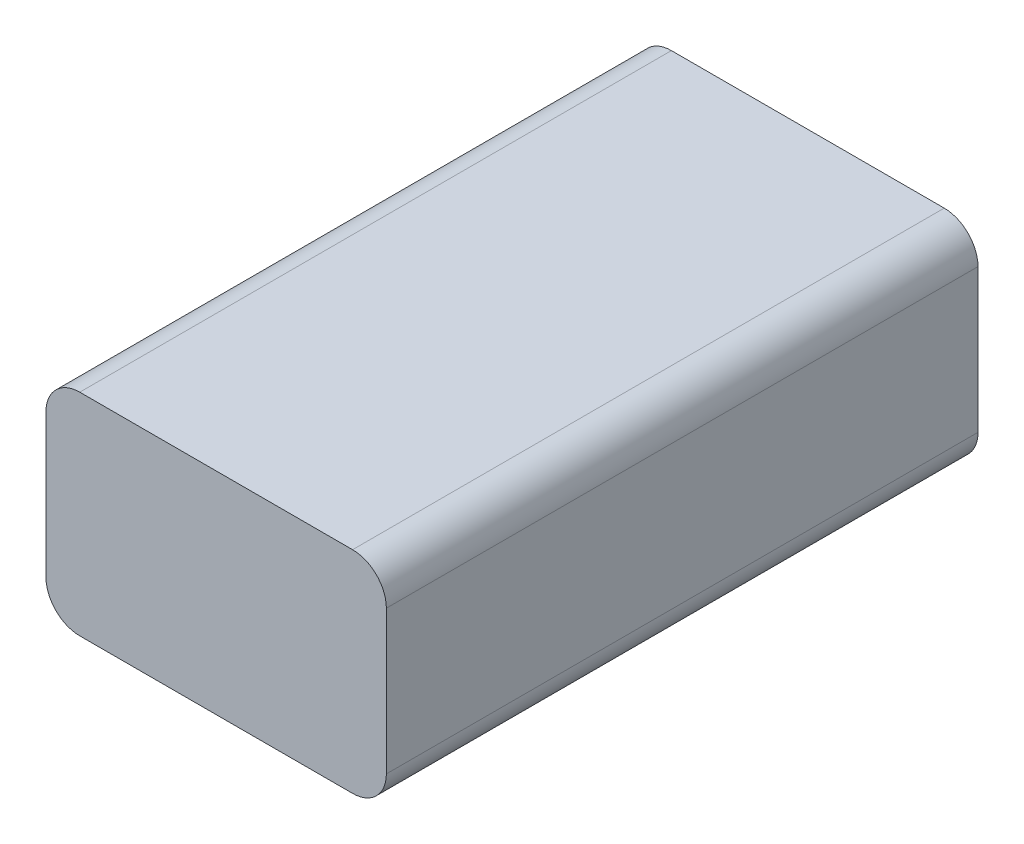
ISO-10303-21;
HEADER;
FILE_DESCRIPTION(('STEP AP214'),'2;1');
FILE_NAME('part.step','',(''),(''),'','','');
FILE_SCHEMA(('AUTOMOTIVE_DESIGN { 1 0 10303 214 1 1 1 1 }'));
ENDSEC;
DATA;
#1=APPLICATION_CONTEXT('core data for automotive mechanical design processes');
#2=APPLICATION_PROTOCOL_DEFINITION('international standard','automotive_design',2000,#1);
#3=PRODUCT_CONTEXT('',#1,'mechanical');
#4=PRODUCT('Part','Part','',(#3));
#5=PRODUCT_RELATED_PRODUCT_CATEGORY('part','',(#4));
#6=PRODUCT_DEFINITION_FORMATION('','',#4);
#7=PRODUCT_DEFINITION_CONTEXT('part definition',#1,'design');
#8=PRODUCT_DEFINITION('design','',#6,#7);
#9=PRODUCT_DEFINITION_SHAPE('','',#8);
#10=(LENGTH_UNIT() NAMED_UNIT(*) SI_UNIT(.MILLI.,.METRE.));
#11=(NAMED_UNIT(*) PLANE_ANGLE_UNIT() SI_UNIT($,.RADIAN.));
#12=(NAMED_UNIT(*) SI_UNIT($,.STERADIAN.) SOLID_ANGLE_UNIT());
#13=UNCERTAINTY_MEASURE_WITH_UNIT(LENGTH_MEASURE(1.E-05),#10,'distance_accuracy_value','');
#14=(GEOMETRIC_REPRESENTATION_CONTEXT(3) GLOBAL_UNCERTAINTY_ASSIGNED_CONTEXT((#13)) GLOBAL_UNIT_ASSIGNED_CONTEXT((#10,
#11,#12)) REPRESENTATION_CONTEXT('',''));
#15=CARTESIAN_POINT('',(0.,0.,0.));
#16=DIRECTION('',(0.,0.,1.));
#17=DIRECTION('',(1.,0.,0.));
#18=AXIS2_PLACEMENT_3D('',#15,#16,#17);
#19=CARTESIAN_POINT('',(0.,15.875,-44.5));
#20=DIRECTION('',(0.,0.,1.));
#21=DIRECTION('',(1.,0.,0.));
#22=AXIS2_PLACEMENT_3D('',#19,#20,#21);
#23=PLANE('',#22);
#24=CARTESIAN_POINT('',(6.06917609963453,7.9375,-44.5));
#25=DIRECTION('',(0.,0.,1.));
#26=DIRECTION('',(1.,0.,0.));
#27=AXIS2_PLACEMENT_3D('',#24,#25,#26);
#28=CIRCLE('',#27,3.10845397462896);
#29=CARTESIAN_POINT('',(9.17763007426349,7.9375,-44.5));
#30=VERTEX_POINT('',#29);
#31=EDGE_CURVE('E364',#30,#30,#28,.F.);
#32=ORIENTED_EDGE('',*,*,#31,.F.);
#33=EDGE_LOOP('',(#32));
#34=FACE_BOUND('',#33,.T.);
#35=DIRECTION('',(0.,-1.,0.));
#36=VECTOR('',#35,1.);
#37=CARTESIAN_POINT('',(25.6,15.875,-44.5));
#38=LINE('',#37,#36);
#39=CARTESIAN_POINT('',(25.6,13.335,-44.5));
#40=VERTEX_POINT('',#39);
#41=CARTESIAN_POINT('',(25.6,2.54,-44.5));
#42=VERTEX_POINT('',#41);
#43=EDGE_CURVE('E353',#40,#42,#38,.T.);
#44=ORIENTED_EDGE('',*,*,#43,.T.);
#45=CARTESIAN_POINT('',(23.06,2.54,-44.5));
#46=DIRECTION('',(0.,0.,1.));
#47=DIRECTION('',(1.,0.,0.));
#48=AXIS2_PLACEMENT_3D('',#45,#46,#47);
#49=CIRCLE('',#48,2.54);
#50=CARTESIAN_POINT('',(23.06,0.,-44.5));
#51=VERTEX_POINT('',#50);
#52=EDGE_CURVE('E384',#42,#51,#49,.F.);
#53=ORIENTED_EDGE('',*,*,#52,.T.);
#54=DIRECTION('',(-1.,0.,0.));
#55=VECTOR('',#54,1.);
#56=CARTESIAN_POINT('',(0.,0.,-44.5));
#57=LINE('',#56,#55);
#58=CARTESIAN_POINT('',(2.54,0.,-44.5));
#59=VERTEX_POINT('',#58);
#60=EDGE_CURVE('E339',#51,#59,#57,.T.);
#61=ORIENTED_EDGE('',*,*,#60,.T.);
#62=CARTESIAN_POINT('',(2.54,2.54,-44.5));
#63=DIRECTION('',(0.,0.,1.));
#64=DIRECTION('',(1.,0.,0.));
#65=AXIS2_PLACEMENT_3D('',#62,#63,#64);
#66=CIRCLE('',#65,2.54);
#67=CARTESIAN_POINT('',(0.,2.54,-44.5));
#68=VERTEX_POINT('',#67);
#69=EDGE_CURVE('E381',#59,#68,#66,.F.);
#70=ORIENTED_EDGE('',*,*,#69,.T.);
#71=DIRECTION('',(0.,-1.,0.));
#72=VECTOR('',#71,1.);
#73=CARTESIAN_POINT('',(0.,15.875,-44.5));
#74=LINE('',#73,#72);
#75=CARTESIAN_POINT('',(0.,13.335,-44.5));
#76=VERTEX_POINT('',#75);
#77=EDGE_CURVE('E343',#76,#68,#74,.T.);
#78=ORIENTED_EDGE('',*,*,#77,.F.);
#79=CARTESIAN_POINT('',(2.54,13.335,-44.5));
#80=DIRECTION('',(0.,0.,1.));
#81=DIRECTION('',(1.,0.,0.));
#82=AXIS2_PLACEMENT_3D('',#79,#80,#81);
#83=CIRCLE('',#82,2.54);
#84=CARTESIAN_POINT('',(2.54,15.875,-44.5));
#85=VERTEX_POINT('',#84);
#86=EDGE_CURVE('E378',#76,#85,#83,.F.);
#87=ORIENTED_EDGE('',*,*,#86,.T.);
#88=DIRECTION('',(-1.,0.,0.));
#89=VECTOR('',#88,1.);
#90=CARTESIAN_POINT('',(0.,15.875,-44.5));
#91=LINE('',#90,#89);
#92=CARTESIAN_POINT('',(23.06,15.875,-44.5));
#93=VERTEX_POINT('',#92);
#94=EDGE_CURVE('E338',#93,#85,#91,.T.);
#95=ORIENTED_EDGE('',*,*,#94,.F.);
#96=CARTESIAN_POINT('',(23.06,13.335,-44.5));
#97=DIRECTION('',(0.,0.,1.));
#98=DIRECTION('',(1.,0.,0.));
#99=AXIS2_PLACEMENT_3D('',#96,#97,#98);
#100=CIRCLE('',#99,2.54);
#101=EDGE_CURVE('E375',#93,#40,#100,.F.);
#102=ORIENTED_EDGE('',*,*,#101,.T.);
#103=EDGE_LOOP('',(#44,#53,#61,#70,#78,#87,#95,#102));
#104=FACE_BOUND('',#103,.T.);
#105=DIRECTION('',(-0.654278635501523,-0.75625357329818,0.));
#106=VECTOR('',#105,1.);
#107=CARTESIAN_POINT('',(22.8214094188601,6.97780152134244,-44.5));
#108=LINE('',#107,#106);
#109=CARTESIAN_POINT('',(22.8214094188601,6.97780152134244,-44.5));
#110=VERTEX_POINT('',#109);
#111=CARTESIAN_POINT('',(19.4902347533947,3.12743470918518,-44.5));
#112=VERTEX_POINT('',#111);
#113=EDGE_CURVE('E200',#110,#112,#108,.T.);
#114=ORIENTED_EDGE('',*,*,#113,.F.);
#115=DIRECTION('',(0.327795488428218,-0.944748706146828,0.));
#116=VECTOR('',#115,1.);
#117=CARTESIAN_POINT('',(21.1524812783761,11.7878668121573,-44.5));
#118=LINE('',#117,#116);
#119=CARTESIAN_POINT('',(21.1524812783761,11.7878668121573,-44.5));
#120=VERTEX_POINT('',#119);
#121=EDGE_CURVE('E260',#120,#110,#118,.T.);
#122=ORIENTED_EDGE('',*,*,#121,.F.);
#123=DIRECTION('',(0.982074123929742,-0.188495132848649,0.));
#124=VECTOR('',#123,1.);
#125=CARTESIAN_POINT('',(16.1523784724267,12.7475652908148,-44.5));
#126=LINE('',#125,#124);
#127=CARTESIAN_POINT('',(16.1523784724267,12.7475652908148,-44.5));
#128=VERTEX_POINT('',#127);
#129=EDGE_CURVE('E291',#128,#120,#126,.T.);
#130=ORIENTED_EDGE('',*,*,#129,.F.);
#131=DIRECTION('',(0.654278635501523,0.756253573298179,0.));
#132=VECTOR('',#131,1.);
#133=CARTESIAN_POINT('',(12.8212038069613,8.89719847865757,-44.5));
#134=LINE('',#133,#132);
#135=CARTESIAN_POINT('',(12.8212038069613,8.89719847865757,-44.5));
#136=VERTEX_POINT('',#135);
#137=EDGE_CURVE('E287',#136,#128,#134,.T.);
#138=ORIENTED_EDGE('',*,*,#137,.F.);
#139=DIRECTION('',(-0.327795488428219,0.944748706146828,0.));
#140=VECTOR('',#139,1.);
#141=CARTESIAN_POINT('',(14.4901319474453,4.08713318784274,-44.5));
#142=LINE('',#141,#140);
#143=CARTESIAN_POINT('',(14.4901319474453,4.08713318784274,-44.5));
#144=VERTEX_POINT('',#143);
#145=EDGE_CURVE('E283',#144,#136,#142,.T.);
#146=ORIENTED_EDGE('',*,*,#145,.F.);
#147=DIRECTION('',(-0.982074123929742,0.188495132848648,0.));
#148=VECTOR('',#147,1.);
#149=CARTESIAN_POINT('',(19.4902347533947,3.12743470918518,-44.5));
#150=LINE('',#149,#148);
#151=EDGE_CURVE('E279',#112,#144,#150,.T.);
#152=ORIENTED_EDGE('',*,*,#151,.F.);
#153=EDGE_LOOP('',(#114,#122,#130,#138,#146,#152));
#154=FACE_BOUND('',#153,.T.);
#155=ADVANCED_FACE('F39',(#34,#104,#154),#23,.F.);
#156=CARTESIAN_POINT('',(0.,15.875,0.));
#157=DIRECTION('',(1.,0.,0.));
#158=DIRECTION('',(0.,0.,-1.));
#159=AXIS2_PLACEMENT_3D('',#156,#157,#158);
#160=PLANE('',#159);
#161=ORIENTED_EDGE('',*,*,#77,.T.);
#162=DIRECTION('',(0.,0.,1.));
#163=VECTOR('',#162,1.);
#164=CARTESIAN_POINT('',(0.,2.54,0.));
#165=LINE('',#164,#163);
#166=CARTESIAN_POINT('',(0.,2.54,0.));
#167=VERTEX_POINT('',#166);
#168=EDGE_CURVE('E406',#68,#167,#165,.T.);
#169=ORIENTED_EDGE('',*,*,#168,.T.);
#170=DIRECTION('',(0.,-1.,0.));
#171=VECTOR('',#170,1.);
#172=CARTESIAN_POINT('',(0.,15.875,0.));
#173=LINE('',#172,#171);
#174=CARTESIAN_POINT('',(0.,13.335,0.));
#175=VERTEX_POINT('',#174);
#176=EDGE_CURVE('E361',#175,#167,#173,.T.);
#177=ORIENTED_EDGE('',*,*,#176,.F.);
#178=DIRECTION('',(0.,0.,1.));
#179=VECTOR('',#178,1.);
#180=CARTESIAN_POINT('',(0.,13.335,0.));
#181=LINE('',#180,#179);
#182=EDGE_CURVE('E403',#175,#76,#181,.F.);
#183=ORIENTED_EDGE('',*,*,#182,.T.);
#184=EDGE_LOOP('',(#161,#169,#177,#183));
#185=FACE_BOUND('',#184,.T.);
#186=ADVANCED_FACE('F442',(#185),#160,.F.);
#187=CARTESIAN_POINT('',(0.,15.875,0.));
#188=DIRECTION('',(0.,0.,-1.));
#189=DIRECTION('',(-1.,0.,0.));
#190=AXIS2_PLACEMENT_3D('',#187,#188,#189);
#191=PLANE('',#190);
#192=DIRECTION('',(1.,0.,0.));
#193=VECTOR('',#192,1.);
#194=CARTESIAN_POINT('',(0.,0.,0.));
#195=LINE('',#194,#193);
#196=CARTESIAN_POINT('',(2.54,0.,0.));
#197=VERTEX_POINT('',#196);
#198=CARTESIAN_POINT('',(23.06,0.,0.));
#199=VERTEX_POINT('',#198);
#200=EDGE_CURVE('E333',#197,#199,#195,.T.);
#201=ORIENTED_EDGE('',*,*,#200,.T.);
#202=CARTESIAN_POINT('',(23.06,2.54,0.));
#203=DIRECTION('',(0.,0.,-1.));
#204=DIRECTION('',(-1.,0.,0.));
#205=AXIS2_PLACEMENT_3D('',#202,#203,#204);
#206=CIRCLE('',#205,2.54);
#207=CARTESIAN_POINT('',(25.6,2.54,0.));
#208=VERTEX_POINT('',#207);
#209=EDGE_CURVE('E400',#199,#208,#206,.F.);
#210=ORIENTED_EDGE('',*,*,#209,.T.);
#211=DIRECTION('',(0.,-1.,0.));
#212=VECTOR('',#211,1.);
#213=CARTESIAN_POINT('',(25.6,15.875,0.));
#214=LINE('',#213,#212);
#215=CARTESIAN_POINT('',(25.6,13.335,0.));
#216=VERTEX_POINT('',#215);
#217=EDGE_CURVE('E357',#216,#208,#214,.T.);
#218=ORIENTED_EDGE('',*,*,#217,.F.);
#219=CARTESIAN_POINT('',(23.06,13.335,0.));
#220=DIRECTION('',(0.,0.,-1.));
#221=DIRECTION('',(-1.,0.,0.));
#222=AXIS2_PLACEMENT_3D('',#219,#220,#221);
#223=CIRCLE('',#222,2.54);
#224=CARTESIAN_POINT('',(23.06,15.875,0.));
#225=VERTEX_POINT('',#224);
#226=EDGE_CURVE('E393',#216,#225,#223,.F.);
#227=ORIENTED_EDGE('',*,*,#226,.T.);
#228=DIRECTION('',(1.,0.,0.));
#229=VECTOR('',#228,1.);
#230=CARTESIAN_POINT('',(0.,15.875,0.));
#231=LINE('',#230,#229);
#232=CARTESIAN_POINT('',(2.54,15.875,0.));
#233=VERTEX_POINT('',#232);
#234=EDGE_CURVE('E334',#233,#225,#231,.T.);
#235=ORIENTED_EDGE('',*,*,#234,.F.);
#236=CARTESIAN_POINT('',(2.54,13.335,0.));
#237=DIRECTION('',(0.,0.,-1.));
#238=DIRECTION('',(-1.,0.,0.));
#239=AXIS2_PLACEMENT_3D('',#236,#237,#238);
#240=CIRCLE('',#239,2.54);
#241=EDGE_CURVE('E63',#233,#175,#240,.F.);
#242=ORIENTED_EDGE('',*,*,#241,.T.);
#243=ORIENTED_EDGE('',*,*,#176,.T.);
#244=CARTESIAN_POINT('',(2.54,2.54,0.));
#245=DIRECTION('',(0.,0.,-1.));
#246=DIRECTION('',(-1.,0.,0.));
#247=AXIS2_PLACEMENT_3D('',#244,#245,#246);
#248=CIRCLE('',#247,2.54);
#249=EDGE_CURVE('E55',#167,#197,#248,.F.);
#250=ORIENTED_EDGE('',*,*,#249,.T.);
#251=EDGE_LOOP('',(#201,#210,#218,#227,#235,#242,#243,#250));
#252=FACE_BOUND('',#251,.T.);
#253=ADVANCED_FACE('F425',(#252),#191,.F.);
#254=CARTESIAN_POINT('',(25.6,15.875,0.));
#255=DIRECTION('',(-1.,0.,0.));
#256=DIRECTION('',(0.,0.,1.));
#257=AXIS2_PLACEMENT_3D('',#254,#255,#256);
#258=PLANE('',#257);
#259=ORIENTED_EDGE('',*,*,#217,.T.);
#260=DIRECTION('',(0.,0.,-1.));
#261=VECTOR('',#260,1.);
#262=CARTESIAN_POINT('',(25.6,2.54,-44.5));
#263=LINE('',#262,#261);
#264=EDGE_CURVE('E371',#208,#42,#263,.T.);
#265=ORIENTED_EDGE('',*,*,#264,.T.);
#266=ORIENTED_EDGE('',*,*,#43,.F.);
#267=DIRECTION('',(0.,0.,-1.));
#268=VECTOR('',#267,1.);
#269=CARTESIAN_POINT('',(25.6,13.335,0.));
#270=LINE('',#269,#268);
#271=EDGE_CURVE('E368',#40,#216,#270,.F.);
#272=ORIENTED_EDGE('',*,*,#271,.T.);
#273=EDGE_LOOP('',(#259,#265,#266,#272));
#274=FACE_BOUND('',#273,.T.);
#275=ADVANCED_FACE('F429',(#274),#258,.F.);
#276=CARTESIAN_POINT('',(0.,15.875,0.));
#277=DIRECTION('',(0.,-1.,0.));
#278=DIRECTION('',(0.,0.,-1.));
#279=AXIS2_PLACEMENT_3D('',#276,#277,#278);
#280=PLANE('',#279);
#281=ORIENTED_EDGE('',*,*,#94,.T.);
#282=DIRECTION('',(0.,0.,1.));
#283=VECTOR('',#282,1.);
#284=CARTESIAN_POINT('',(2.54,15.875,0.));
#285=LINE('',#284,#283);
#286=EDGE_CURVE('E11',#85,#233,#285,.T.);
#287=ORIENTED_EDGE('',*,*,#286,.T.);
#288=ORIENTED_EDGE('',*,*,#234,.T.);
#289=DIRECTION('',(0.,0.,-1.));
#290=VECTOR('',#289,1.);
#291=CARTESIAN_POINT('',(23.06,15.875,0.));
#292=LINE('',#291,#290);
#293=EDGE_CURVE('E48',#225,#93,#292,.T.);
#294=ORIENTED_EDGE('',*,*,#293,.T.);
#295=EDGE_LOOP('',(#281,#287,#288,#294));
#296=FACE_BOUND('',#295,.T.);
#297=ADVANCED_FACE('F413',(#296),#280,.F.);
#298=CARTESIAN_POINT('',(0.,0.,0.));
#299=DIRECTION('',(0.,-1.,0.));
#300=DIRECTION('',(0.,0.,-1.));
#301=AXIS2_PLACEMENT_3D('',#298,#299,#300);
#302=PLANE('',#301);
#303=ORIENTED_EDGE('',*,*,#60,.F.);
#304=DIRECTION('',(0.,0.,-1.));
#305=VECTOR('',#304,1.);
#306=CARTESIAN_POINT('',(23.06,0.,0.));
#307=LINE('',#306,#305);
#308=EDGE_CURVE('E390',#51,#199,#307,.F.);
#309=ORIENTED_EDGE('',*,*,#308,.T.);
#310=ORIENTED_EDGE('',*,*,#200,.F.);
#311=DIRECTION('',(0.,0.,1.));
#312=VECTOR('',#311,1.);
#313=CARTESIAN_POINT('',(2.54,0.,-44.5));
#314=LINE('',#313,#312);
#315=EDGE_CURVE('E387',#197,#59,#314,.F.);
#316=ORIENTED_EDGE('',*,*,#315,.T.);
#317=EDGE_LOOP('',(#303,#309,#310,#316));
#318=FACE_BOUND('',#317,.T.);
#319=ADVANCED_FACE('F436',(#318),#302,.T.);
#320=CARTESIAN_POINT('',(6.06917609963453,7.9375,-46.5));
#321=DIRECTION('',(0.,0.,-1.));
#322=DIRECTION('',(-1.,0.,0.));
#323=AXIS2_PLACEMENT_3D('',#320,#321,#322);
#324=PLANE('',#323);
#325=CARTESIAN_POINT('',(6.06917609963453,7.9375,-46.5));
#326=DIRECTION('',(0.,0.,-1.));
#327=DIRECTION('',(-1.,0.,0.));
#328=AXIS2_PLACEMENT_3D('',#325,#326,#327);
#329=CIRCLE('',#328,3.10845397462896);
#330=CARTESIAN_POINT('',(2.96072212500557,7.9375,-46.5));
#331=VERTEX_POINT('',#330);
#332=EDGE_CURVE('E326',#331,#331,#329,.T.);
#333=ORIENTED_EDGE('',*,*,#332,.T.);
#334=EDGE_LOOP('',(#333));
#335=FACE_BOUND('',#334,.T.);
#336=CARTESIAN_POINT('',(6.06917609963453,7.9375,-46.5));
#337=DIRECTION('',(0.,0.,-1.));
#338=DIRECTION('',(-1.,0.,0.));
#339=AXIS2_PLACEMENT_3D('',#336,#337,#338);
#340=CIRCLE('',#339,2.61557307411876);
#341=CARTESIAN_POINT('',(3.45360302551578,7.9375,-46.5));
#342=VERTEX_POINT('',#341);
#343=EDGE_CURVE('E322',#342,#342,#340,.T.);
#344=ORIENTED_EDGE('',*,*,#343,.F.);
#345=EDGE_LOOP('',(#344));
#346=FACE_BOUND('',#345,.T.);
#347=ADVANCED_FACE('F492',(#335,#346),#324,.T.);
#348=CARTESIAN_POINT('',(6.06917609963453,7.9375,-46.5));
#349=DIRECTION('',(0.,0.,1.));
#350=DIRECTION('',(1.,0.,0.));
#351=AXIS2_PLACEMENT_3D('',#348,#349,#350);
#352=CYLINDRICAL_SURFACE('',#351,3.10845397462896);
#353=ORIENTED_EDGE('',*,*,#332,.F.);
#354=EDGE_LOOP('',(#353));
#355=FACE_BOUND('',#354,.T.);
#356=ORIENTED_EDGE('',*,*,#31,.T.);
#357=EDGE_LOOP('',(#356));
#358=FACE_BOUND('',#357,.T.);
#359=ADVANCED_FACE('F674',(#355,#358),#352,.T.);
#360=CARTESIAN_POINT('',(6.06917609963453,7.9375,-46.5));
#361=DIRECTION('',(0.,0.,1.));
#362=DIRECTION('',(1.,0.,0.));
#363=AXIS2_PLACEMENT_3D('',#360,#361,#362);
#364=CYLINDRICAL_SURFACE('',#363,2.61557307411876);
#365=ORIENTED_EDGE('',*,*,#343,.T.);
#366=EDGE_LOOP('',(#365));
#367=FACE_BOUND('',#366,.T.);
#368=CARTESIAN_POINT('',(6.06917609963453,7.9375,-44.5));
#369=DIRECTION('',(0.,0.,-1.));
#370=DIRECTION('',(-1.,0.,0.));
#371=AXIS2_PLACEMENT_3D('',#368,#369,#370);
#372=CIRCLE('',#371,2.61557307411876);
#373=CARTESIAN_POINT('',(3.45360302551578,7.9375,-44.5));
#374=VERTEX_POINT('',#373);
#375=EDGE_CURVE('E321',#374,#374,#372,.T.);
#376=ORIENTED_EDGE('',*,*,#375,.F.);
#377=EDGE_LOOP('',(#376));
#378=FACE_BOUND('',#377,.T.);
#379=ADVANCED_FACE('F666',(#367,#378),#364,.F.);
#380=ORIENTED_EDGE('',*,*,#375,.T.);
#381=EDGE_LOOP('',(#380));
#382=FACE_BOUND('',#381,.T.);
#383=ADVANCED_FACE('F452',(#382),#23,.F.);
#384=CARTESIAN_POINT('',(0.,0.,-46.5));
#385=DIRECTION('',(0.,0.,-1.));
#386=DIRECTION('',(-1.,0.,0.));
#387=AXIS2_PLACEMENT_3D('',#384,#385,#386);
#388=PLANE('',#387);
#389=DIRECTION('',(-0.654278635501523,-0.75625357329818,0.));
#390=VECTOR('',#389,1.);
#391=CARTESIAN_POINT('',(22.8214094188601,6.97780152134244,-46.5));
#392=LINE('',#391,#390);
#393=CARTESIAN_POINT('',(22.8214094188601,6.97780152134244,-46.5));
#394=VERTEX_POINT('',#393);
#395=CARTESIAN_POINT('',(19.4902347533947,3.12743470918518,-46.5));
#396=VERTEX_POINT('',#395);
#397=EDGE_CURVE('E255',#394,#396,#392,.T.);
#398=ORIENTED_EDGE('',*,*,#397,.T.);
#399=DIRECTION('',(-0.982074123929742,0.188495132848648,0.));
#400=VECTOR('',#399,1.);
#401=CARTESIAN_POINT('',(19.4902347533947,3.12743470918518,-46.5));
#402=LINE('',#401,#400);
#403=CARTESIAN_POINT('',(14.4901319474453,4.08713318784274,-46.5));
#404=VERTEX_POINT('',#403);
#405=EDGE_CURVE('E259',#396,#404,#402,.T.);
#406=ORIENTED_EDGE('',*,*,#405,.T.);
#407=DIRECTION('',(-0.327795488428219,0.944748706146828,0.));
#408=VECTOR('',#407,1.);
#409=CARTESIAN_POINT('',(14.4901319474453,4.08713318784274,-46.5));
#410=LINE('',#409,#408);
#411=CARTESIAN_POINT('',(12.8212038069613,8.89719847865757,-46.5));
#412=VERTEX_POINT('',#411);
#413=EDGE_CURVE('E263',#404,#412,#410,.T.);
#414=ORIENTED_EDGE('',*,*,#413,.T.);
#415=DIRECTION('',(0.654278635501523,0.756253573298179,0.));
#416=VECTOR('',#415,1.);
#417=CARTESIAN_POINT('',(12.8212038069613,8.89719847865757,-46.5));
#418=LINE('',#417,#416);
#419=CARTESIAN_POINT('',(16.1523784724267,12.7475652908148,-46.5));
#420=VERTEX_POINT('',#419);
#421=EDGE_CURVE('E266',#412,#420,#418,.T.);
#422=ORIENTED_EDGE('',*,*,#421,.T.);
#423=DIRECTION('',(0.982074123929742,-0.188495132848649,0.));
#424=VECTOR('',#423,1.);
#425=CARTESIAN_POINT('',(16.1523784724267,12.7475652908148,-46.5));
#426=LINE('',#425,#424);
#427=CARTESIAN_POINT('',(21.1524812783761,11.7878668121573,-46.5));
#428=VERTEX_POINT('',#427);
#429=EDGE_CURVE('E269',#420,#428,#426,.T.);
#430=ORIENTED_EDGE('',*,*,#429,.T.);
#431=DIRECTION('',(0.327795488428218,-0.944748706146828,0.));
#432=VECTOR('',#431,1.);
#433=CARTESIAN_POINT('',(21.1524812783761,11.7878668121573,-46.5));
#434=LINE('',#433,#432);
#435=EDGE_CURVE('E272',#428,#394,#434,.T.);
#436=ORIENTED_EDGE('',*,*,#435,.T.);
#437=EDGE_LOOP('',(#398,#406,#414,#422,#430,#436));
#438=FACE_BOUND('',#437,.T.);
#439=DIRECTION('',(-0.981436231883187,0.191788745099733,0.));
#440=VECTOR('',#439,1.);
#441=CARTESIAN_POINT('',(19.2526577159093,3.7670358831486,-46.5));
#442=LINE('',#441,#440);
#443=CARTESIAN_POINT('',(19.2526577159093,3.7670358831486,-46.5));
#444=VERTEX_POINT('',#443);
#445=CARTESIAN_POINT('',(14.9252542936453,4.6126815246426,-46.5));
#446=VERTEX_POINT('',#445);
#447=EDGE_CURVE('E191',#444,#446,#442,.T.);
#448=ORIENTED_EDGE('',*,*,#447,.F.);
#449=DIRECTION('',(-0.656812041357901,-0.754054336455449,0.));
#450=VECTOR('',#449,1.);
#451=CARTESIAN_POINT('',(22.1487100351748,7.091854358506,-46.5));
#452=LINE('',#451,#450);
#453=CARTESIAN_POINT('',(22.1487100351748,7.091854358506,-46.5));
#454=VERTEX_POINT('',#453);
#455=EDGE_CURVE('E180',#454,#444,#452,.T.);
#456=ORIENTED_EDGE('',*,*,#455,.F.);
#457=DIRECTION('',(0.324624190525286,-0.945843081555182,0.));
#458=VECTOR('',#457,1.);
#459=CARTESIAN_POINT('',(20.7173589321761,11.2623184753574,-46.5));
#460=LINE('',#459,#458);
#461=CARTESIAN_POINT('',(20.7173589321761,11.2623184753574,-46.5));
#462=VERTEX_POINT('',#461);
#463=EDGE_CURVE('E219',#462,#454,#460,.T.);
#464=ORIENTED_EDGE('',*,*,#463,.F.);
#465=DIRECTION('',(0.981436231883187,-0.191788745099733,0.));
#466=VECTOR('',#465,1.);
#467=CARTESIAN_POINT('',(16.3899555099121,12.1079641168514,-46.5));
#468=LINE('',#467,#466);
#469=CARTESIAN_POINT('',(16.3899555099121,12.1079641168514,-46.5));
#470=VERTEX_POINT('',#469);
#471=EDGE_CURVE('E215',#470,#462,#468,.T.);
#472=ORIENTED_EDGE('',*,*,#471,.F.);
#473=DIRECTION('',(0.656812041357901,0.754054336455449,0.));
#474=VECTOR('',#473,1.);
#475=CARTESIAN_POINT('',(13.4939031906466,8.783145641494,-46.5));
#476=LINE('',#475,#474);
#477=CARTESIAN_POINT('',(13.4939031906466,8.783145641494,-46.5));
#478=VERTEX_POINT('',#477);
#479=EDGE_CURVE('E210',#478,#470,#476,.T.);
#480=ORIENTED_EDGE('',*,*,#479,.F.);
#481=DIRECTION('',(-0.324624190525287,0.945843081555182,0.));
#482=VECTOR('',#481,1.);
#483=CARTESIAN_POINT('',(14.9252542936453,4.6126815246426,-46.5));
#484=LINE('',#483,#482);
#485=EDGE_CURVE('E206',#446,#478,#484,.T.);
#486=ORIENTED_EDGE('',*,*,#485,.F.);
#487=EDGE_LOOP('',(#448,#456,#464,#472,#480,#486));
#488=FACE_BOUND('',#487,.T.);
#489=ADVANCED_FACE('F204',(#438,#488),#388,.T.);
#490=CARTESIAN_POINT('',(22.8214094188601,6.97780152134244,-46.5));
#491=DIRECTION('',(-0.75625357329818,0.654278635501523,0.));
#492=DIRECTION('',(-0.654278635501523,-0.75625357329818,0.));
#493=AXIS2_PLACEMENT_3D('',#490,#491,#492);
#494=PLANE('',#493);
#495=ORIENTED_EDGE('',*,*,#113,.T.);
#496=DIRECTION('',(0.,0.,1.));
#497=VECTOR('',#496,1.);
#498=CARTESIAN_POINT('',(19.4902347533947,3.12743470918518,-46.5));
#499=LINE('',#498,#497);
#500=EDGE_CURVE('E317',#396,#112,#499,.T.);
#501=ORIENTED_EDGE('',*,*,#500,.F.);
#502=ORIENTED_EDGE('',*,*,#397,.F.);
#503=DIRECTION('',(0.,0.,1.));
#504=VECTOR('',#503,1.);
#505=CARTESIAN_POINT('',(22.8214094188601,6.97780152134244,-46.5));
#506=LINE('',#505,#504);
#507=EDGE_CURVE('E275',#394,#110,#506,.T.);
#508=ORIENTED_EDGE('',*,*,#507,.T.);
#509=EDGE_LOOP('',(#495,#501,#502,#508));
#510=FACE_BOUND('',#509,.T.);
#511=ADVANCED_FACE('F638',(#510),#494,.F.);
#512=CARTESIAN_POINT('',(19.4902347533947,3.12743470918518,-46.5));
#513=DIRECTION('',(0.188495132848648,0.982074123929742,0.));
#514=DIRECTION('',(-0.982074123929742,0.188495132848648,0.));
#515=AXIS2_PLACEMENT_3D('',#512,#513,#514);
#516=PLANE('',#515);
#517=ORIENTED_EDGE('',*,*,#151,.T.);
#518=DIRECTION('',(0.,0.,1.));
#519=VECTOR('',#518,1.);
#520=CARTESIAN_POINT('',(14.4901319474453,4.08713318784274,-46.5));
#521=LINE('',#520,#519);
#522=EDGE_CURVE('E313',#404,#144,#521,.T.);
#523=ORIENTED_EDGE('',*,*,#522,.F.);
#524=ORIENTED_EDGE('',*,*,#405,.F.);
#525=ORIENTED_EDGE('',*,*,#500,.T.);
#526=EDGE_LOOP('',(#517,#523,#524,#525));
#527=FACE_BOUND('',#526,.T.);
#528=ADVANCED_FACE('F628',(#527),#516,.F.);
#529=CARTESIAN_POINT('',(14.4901319474453,4.08713318784274,-46.5));
#530=DIRECTION('',(0.944748706146828,0.327795488428219,0.));
#531=DIRECTION('',(-0.327795488428219,0.944748706146828,0.));
#532=AXIS2_PLACEMENT_3D('',#529,#530,#531);
#533=PLANE('',#532);
#534=ORIENTED_EDGE('',*,*,#145,.T.);
#535=DIRECTION('',(0.,0.,1.));
#536=VECTOR('',#535,1.);
#537=CARTESIAN_POINT('',(12.8212038069613,8.89719847865757,-46.5));
#538=LINE('',#537,#536);
#539=EDGE_CURVE('E309',#412,#136,#538,.T.);
#540=ORIENTED_EDGE('',*,*,#539,.F.);
#541=ORIENTED_EDGE('',*,*,#413,.F.);
#542=ORIENTED_EDGE('',*,*,#522,.T.);
#543=EDGE_LOOP('',(#534,#540,#541,#542));
#544=FACE_BOUND('',#543,.T.);
#545=ADVANCED_FACE('F618',(#544),#533,.F.);
#546=CARTESIAN_POINT('',(12.8212038069613,8.89719847865757,-46.5));
#547=DIRECTION('',(0.756253573298179,-0.654278635501523,0.));
#548=DIRECTION('',(0.654278635501523,0.75625357329818,0.));
#549=AXIS2_PLACEMENT_3D('',#546,#547,#548);
#550=PLANE('',#549);
#551=ORIENTED_EDGE('',*,*,#137,.T.);
#552=DIRECTION('',(0.,0.,1.));
#553=VECTOR('',#552,1.);
#554=CARTESIAN_POINT('',(16.1523784724267,12.7475652908148,-46.5));
#555=LINE('',#554,#553);
#556=EDGE_CURVE('E305',#420,#128,#555,.T.);
#557=ORIENTED_EDGE('',*,*,#556,.F.);
#558=ORIENTED_EDGE('',*,*,#421,.F.);
#559=ORIENTED_EDGE('',*,*,#539,.T.);
#560=EDGE_LOOP('',(#551,#557,#558,#559));
#561=FACE_BOUND('',#560,.T.);
#562=ADVANCED_FACE('F608',(#561),#550,.F.);
#563=CARTESIAN_POINT('',(16.1523784724267,12.7475652908148,-46.5));
#564=DIRECTION('',(-0.188495132848649,-0.982074123929742,0.));
#565=DIRECTION('',(0.982074123929742,-0.188495132848649,0.));
#566=AXIS2_PLACEMENT_3D('',#563,#564,#565);
#567=PLANE('',#566);
#568=ORIENTED_EDGE('',*,*,#129,.T.);
#569=DIRECTION('',(0.,0.,1.));
#570=VECTOR('',#569,1.);
#571=CARTESIAN_POINT('',(21.1524812783761,11.7878668121573,-46.5));
#572=LINE('',#571,#570);
#573=EDGE_CURVE('E301',#428,#120,#572,.T.);
#574=ORIENTED_EDGE('',*,*,#573,.F.);
#575=ORIENTED_EDGE('',*,*,#429,.F.);
#576=ORIENTED_EDGE('',*,*,#556,.T.);
#577=EDGE_LOOP('',(#568,#574,#575,#576));
#578=FACE_BOUND('',#577,.T.);
#579=ADVANCED_FACE('F598',(#578),#567,.F.);
#580=CARTESIAN_POINT('',(21.1524812783761,11.7878668121573,-46.5));
#581=DIRECTION('',(-0.944748706146828,-0.327795488428218,0.));
#582=DIRECTION('',(0.327795488428218,-0.944748706146828,0.));
#583=AXIS2_PLACEMENT_3D('',#580,#581,#582);
#584=PLANE('',#583);
#585=ORIENTED_EDGE('',*,*,#121,.T.);
#586=ORIENTED_EDGE('',*,*,#507,.F.);
#587=ORIENTED_EDGE('',*,*,#435,.F.);
#588=ORIENTED_EDGE('',*,*,#573,.T.);
#589=EDGE_LOOP('',(#585,#586,#587,#588));
#590=FACE_BOUND('',#589,.T.);
#591=ADVANCED_FACE('F589',(#590),#584,.F.);
#592=CARTESIAN_POINT('',(22.1487100351748,7.091854358506,-46.5));
#593=DIRECTION('',(-0.754054336455449,0.656812041357901,0.));
#594=DIRECTION('',(-0.656812041357901,-0.754054336455449,0.));
#595=AXIS2_PLACEMENT_3D('',#592,#593,#594);
#596=PLANE('',#595);
#597=DIRECTION('',(-0.656812041357901,-0.754054336455449,0.));
#598=VECTOR('',#597,1.);
#599=CARTESIAN_POINT('',(22.1487100351748,7.091854358506,-44.5));
#600=LINE('',#599,#598);
#601=CARTESIAN_POINT('',(22.1487100351748,7.091854358506,-44.5));
#602=VERTEX_POINT('',#601);
#603=CARTESIAN_POINT('',(19.2526577159093,3.7670358831486,-44.5));
#604=VERTEX_POINT('',#603);
#605=EDGE_CURVE('E222',#602,#604,#600,.T.);
#606=ORIENTED_EDGE('',*,*,#605,.F.);
#607=DIRECTION('',(0.,0.,1.));
#608=VECTOR('',#607,1.);
#609=CARTESIAN_POINT('',(22.1487100351748,7.091854358506,-46.5));
#610=LINE('',#609,#608);
#611=EDGE_CURVE('E186',#454,#602,#610,.T.);
#612=ORIENTED_EDGE('',*,*,#611,.F.);
#613=ORIENTED_EDGE('',*,*,#455,.T.);
#614=DIRECTION('',(0.,0.,1.));
#615=VECTOR('',#614,1.);
#616=CARTESIAN_POINT('',(19.2526577159093,3.7670358831486,-46.5));
#617=LINE('',#616,#615);
#618=EDGE_CURVE('E184',#444,#604,#617,.T.);
#619=ORIENTED_EDGE('',*,*,#618,.T.);
#620=EDGE_LOOP('',(#606,#612,#613,#619));
#621=FACE_BOUND('',#620,.T.);
#622=ADVANCED_FACE('F183',(#621),#596,.T.);
#623=CARTESIAN_POINT('',(19.2526577159093,3.7670358831486,-46.5));
#624=DIRECTION('',(0.191788745099733,0.981436231883188,0.));
#625=DIRECTION('',(-0.981436231883187,0.191788745099733,0.));
#626=AXIS2_PLACEMENT_3D('',#623,#624,#625);
#627=PLANE('',#626);
#628=DIRECTION('',(-0.981436231883187,0.191788745099733,0.));
#629=VECTOR('',#628,1.);
#630=CARTESIAN_POINT('',(19.2526577159093,3.7670358831486,-44.5));
#631=LINE('',#630,#629);
#632=CARTESIAN_POINT('',(14.9252542936453,4.6126815246426,-44.5));
#633=VERTEX_POINT('',#632);
#634=EDGE_CURVE('E198',#604,#633,#631,.T.);
#635=ORIENTED_EDGE('',*,*,#634,.F.);
#636=ORIENTED_EDGE('',*,*,#618,.F.);
#637=ORIENTED_EDGE('',*,*,#447,.T.);
#638=DIRECTION('',(0.,0.,1.));
#639=VECTOR('',#638,1.);
#640=CARTESIAN_POINT('',(14.9252542936453,4.6126815246426,-46.5));
#641=LINE('',#640,#639);
#642=EDGE_CURVE('E201',#446,#633,#641,.T.);
#643=ORIENTED_EDGE('',*,*,#642,.T.);
#644=EDGE_LOOP('',(#635,#636,#637,#643));
#645=FACE_BOUND('',#644,.T.);
#646=ADVANCED_FACE('F195',(#645),#627,.T.);
#647=CARTESIAN_POINT('',(14.9252542936453,4.6126815246426,-46.5));
#648=DIRECTION('',(0.945843081555182,0.324624190525287,0.));
#649=DIRECTION('',(-0.324624190525287,0.945843081555182,0.));
#650=AXIS2_PLACEMENT_3D('',#647,#648,#649);
#651=PLANE('',#650);
#652=DIRECTION('',(-0.324624190525287,0.945843081555182,0.));
#653=VECTOR('',#652,1.);
#654=CARTESIAN_POINT('',(14.9252542936453,4.6126815246426,-44.5));
#655=LINE('',#654,#653);
#656=CARTESIAN_POINT('',(13.4939031906466,8.783145641494,-44.5));
#657=VERTEX_POINT('',#656);
#658=EDGE_CURVE('E227',#633,#657,#655,.T.);
#659=ORIENTED_EDGE('',*,*,#658,.F.);
#660=ORIENTED_EDGE('',*,*,#642,.F.);
#661=ORIENTED_EDGE('',*,*,#485,.T.);
#662=DIRECTION('',(0.,0.,1.));
#663=VECTOR('',#662,1.);
#664=CARTESIAN_POINT('',(13.4939031906466,8.783145641494,-46.5));
#665=LINE('',#664,#663);
#666=EDGE_CURVE('E250',#478,#657,#665,.T.);
#667=ORIENTED_EDGE('',*,*,#666,.T.);
#668=EDGE_LOOP('',(#659,#660,#661,#667));
#669=FACE_BOUND('',#668,.T.);
#670=ADVANCED_FACE('F562',(#669),#651,.T.);
#671=CARTESIAN_POINT('',(13.4939031906466,8.783145641494,-46.5));
#672=DIRECTION('',(0.754054336455449,-0.656812041357901,0.));
#673=DIRECTION('',(0.656812041357901,0.754054336455449,0.));
#674=AXIS2_PLACEMENT_3D('',#671,#672,#673);
#675=PLANE('',#674);
#676=DIRECTION('',(0.656812041357901,0.754054336455449,0.));
#677=VECTOR('',#676,1.);
#678=CARTESIAN_POINT('',(13.4939031906466,8.783145641494,-44.5));
#679=LINE('',#678,#677);
#680=CARTESIAN_POINT('',(16.3899555099121,12.1079641168514,-44.5));
#681=VERTEX_POINT('',#680);
#682=EDGE_CURVE('E231',#657,#681,#679,.T.);
#683=ORIENTED_EDGE('',*,*,#682,.F.);
#684=ORIENTED_EDGE('',*,*,#666,.F.);
#685=ORIENTED_EDGE('',*,*,#479,.T.);
#686=DIRECTION('',(0.,0.,1.));
#687=VECTOR('',#686,1.);
#688=CARTESIAN_POINT('',(16.3899555099121,12.1079641168514,-46.5));
#689=LINE('',#688,#687);
#690=EDGE_CURVE('E247',#470,#681,#689,.T.);
#691=ORIENTED_EDGE('',*,*,#690,.T.);
#692=EDGE_LOOP('',(#683,#684,#685,#691));
#693=FACE_BOUND('',#692,.T.);
#694=ADVANCED_FACE('F552',(#693),#675,.T.);
#695=CARTESIAN_POINT('',(16.3899555099121,12.1079641168514,-46.5));
#696=DIRECTION('',(-0.191788745099733,-0.981436231883188,0.));
#697=DIRECTION('',(0.981436231883187,-0.191788745099733,0.));
#698=AXIS2_PLACEMENT_3D('',#695,#696,#697);
#699=PLANE('',#698);
#700=DIRECTION('',(0.981436231883187,-0.191788745099733,0.));
#701=VECTOR('',#700,1.);
#702=CARTESIAN_POINT('',(16.3899555099121,12.1079641168514,-44.5));
#703=LINE('',#702,#701);
#704=CARTESIAN_POINT('',(20.7173589321761,11.2623184753574,-44.5));
#705=VERTEX_POINT('',#704);
#706=EDGE_CURVE('E235',#681,#705,#703,.T.);
#707=ORIENTED_EDGE('',*,*,#706,.F.);
#708=ORIENTED_EDGE('',*,*,#690,.F.);
#709=ORIENTED_EDGE('',*,*,#471,.T.);
#710=DIRECTION('',(0.,0.,1.));
#711=VECTOR('',#710,1.);
#712=CARTESIAN_POINT('',(20.7173589321761,11.2623184753574,-46.5));
#713=LINE('',#712,#711);
#714=EDGE_CURVE('E244',#462,#705,#713,.T.);
#715=ORIENTED_EDGE('',*,*,#714,.T.);
#716=EDGE_LOOP('',(#707,#708,#709,#715));
#717=FACE_BOUND('',#716,.T.);
#718=ADVANCED_FACE('F542',(#717),#699,.T.);
#719=CARTESIAN_POINT('',(20.7173589321761,11.2623184753574,-46.5));
#720=DIRECTION('',(-0.945843081555182,-0.324624190525286,0.));
#721=DIRECTION('',(0.324624190525286,-0.945843081555182,0.));
#722=AXIS2_PLACEMENT_3D('',#719,#720,#721);
#723=PLANE('',#722);
#724=DIRECTION('',(0.324624190525286,-0.945843081555182,0.));
#725=VECTOR('',#724,1.);
#726=CARTESIAN_POINT('',(20.7173589321761,11.2623184753574,-44.5));
#727=LINE('',#726,#725);
#728=EDGE_CURVE('E192',#705,#602,#727,.T.);
#729=ORIENTED_EDGE('',*,*,#728,.F.);
#730=ORIENTED_EDGE('',*,*,#714,.F.);
#731=ORIENTED_EDGE('',*,*,#463,.T.);
#732=ORIENTED_EDGE('',*,*,#611,.T.);
#733=EDGE_LOOP('',(#729,#730,#731,#732));
#734=FACE_BOUND('',#733,.T.);
#735=ADVANCED_FACE('F534',(#734),#723,.T.);
#736=ORIENTED_EDGE('',*,*,#728,.T.);
#737=ORIENTED_EDGE('',*,*,#605,.T.);
#738=ORIENTED_EDGE('',*,*,#634,.T.);
#739=ORIENTED_EDGE('',*,*,#658,.T.);
#740=ORIENTED_EDGE('',*,*,#682,.T.);
#741=ORIENTED_EDGE('',*,*,#706,.T.);
#742=EDGE_LOOP('',(#736,#737,#738,#739,#740,#741));
#743=FACE_BOUND('',#742,.T.);
#744=ADVANCED_FACE('F453',(#743),#23,.F.);
#745=CARTESIAN_POINT('',(23.06,2.54,0.));
#746=DIRECTION('',(0.,0.,1.));
#747=DIRECTION('',(1.,0.,0.));
#748=AXIS2_PLACEMENT_3D('',#745,#746,#747);
#749=CYLINDRICAL_SURFACE('',#748,2.54);
#750=ORIENTED_EDGE('',*,*,#209,.F.);
#751=ORIENTED_EDGE('',*,*,#308,.F.);
#752=ORIENTED_EDGE('',*,*,#52,.F.);
#753=ORIENTED_EDGE('',*,*,#264,.F.);
#754=EDGE_LOOP('',(#750,#751,#752,#753));
#755=FACE_BOUND('',#754,.T.);
#756=ADVANCED_FACE('F439',(#755),#749,.T.);
#757=CARTESIAN_POINT('',(2.54,2.54,0.));
#758=DIRECTION('',(0.,0.,-1.));
#759=DIRECTION('',(-1.,0.,0.));
#760=AXIS2_PLACEMENT_3D('',#757,#758,#759);
#761=CYLINDRICAL_SURFACE('',#760,2.54);
#762=ORIENTED_EDGE('',*,*,#69,.F.);
#763=ORIENTED_EDGE('',*,*,#315,.F.);
#764=ORIENTED_EDGE('',*,*,#249,.F.);
#765=ORIENTED_EDGE('',*,*,#168,.F.);
#766=EDGE_LOOP('',(#762,#763,#764,#765));
#767=FACE_BOUND('',#766,.T.);
#768=ADVANCED_FACE('F440',(#767),#761,.T.);
#769=CARTESIAN_POINT('',(2.54,13.335,0.));
#770=DIRECTION('',(0.,0.,1.));
#771=DIRECTION('',(1.,0.,0.));
#772=AXIS2_PLACEMENT_3D('',#769,#770,#771);
#773=CYLINDRICAL_SURFACE('',#772,2.54);
#774=ORIENTED_EDGE('',*,*,#86,.F.);
#775=ORIENTED_EDGE('',*,*,#182,.F.);
#776=ORIENTED_EDGE('',*,*,#241,.F.);
#777=ORIENTED_EDGE('',*,*,#286,.F.);
#778=EDGE_LOOP('',(#774,#775,#776,#777));
#779=FACE_BOUND('',#778,.T.);
#780=ADVANCED_FACE('F424',(#779),#773,.T.);
#781=CARTESIAN_POINT('',(23.06,13.335,0.));
#782=DIRECTION('',(0.,0.,-1.));
#783=DIRECTION('',(-1.,0.,0.));
#784=AXIS2_PLACEMENT_3D('',#781,#782,#783);
#785=CYLINDRICAL_SURFACE('',#784,2.54);
#786=ORIENTED_EDGE('',*,*,#226,.F.);
#787=ORIENTED_EDGE('',*,*,#271,.F.);
#788=ORIENTED_EDGE('',*,*,#101,.F.);
#789=ORIENTED_EDGE('',*,*,#293,.F.);
#790=EDGE_LOOP('',(#786,#787,#788,#789));
#791=FACE_BOUND('',#790,.T.);
#792=ADVANCED_FACE('F41',(#791),#785,.T.);
#793=CLOSED_SHELL('',(#155,#186,#253,#275,#297,#319,#347,#359,#379,#383,#489,#511,#528,#545,
#562,#579,#591,#622,#646,#670,#694,#718,#735,#744,#756,#768,#780,#792));
#794=MANIFOLD_SOLID_BREP('B2',#793);
#795=ADVANCED_BREP_SHAPE_REPRESENTATION('',(#18,#794),#14);
#796=SHAPE_DEFINITION_REPRESENTATION(#9,#795);
ENDSEC;
END-ISO-10303-21;
